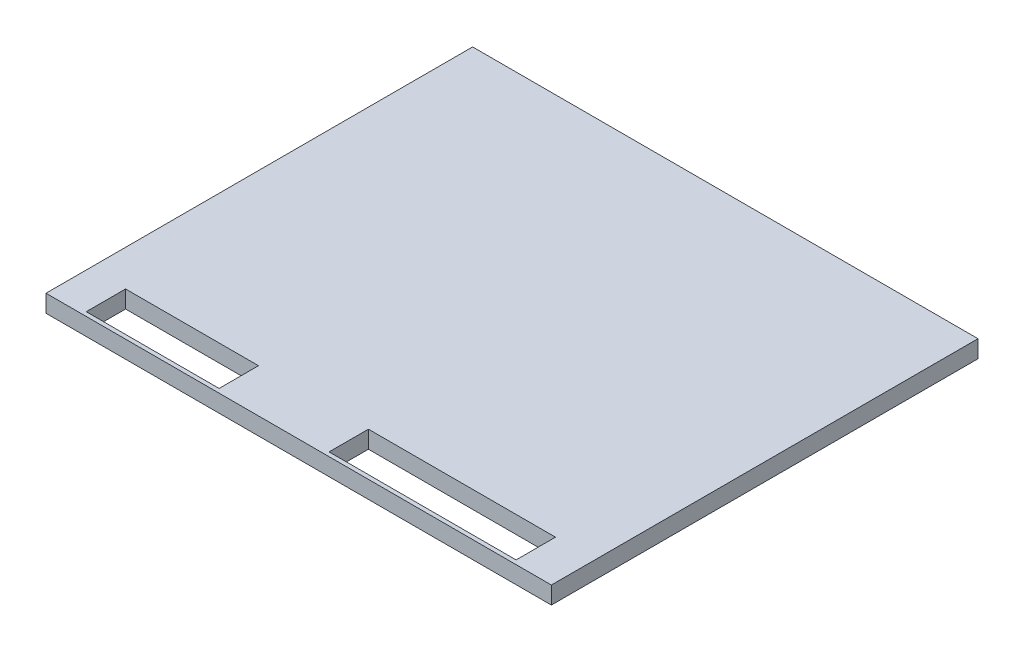
ISO-10303-21;
HEADER;
FILE_DESCRIPTION(('STEP AP214'),'2;1');
FILE_NAME('part.step','',(''),(''),'','','');
FILE_SCHEMA(('AUTOMOTIVE_DESIGN { 1 0 10303 214 1 1 1 1 }'));
ENDSEC;
DATA;
#1=APPLICATION_CONTEXT('core data for automotive mechanical design processes');
#2=APPLICATION_PROTOCOL_DEFINITION('international standard','automotive_design',2000,#1);
#3=PRODUCT_CONTEXT('',#1,'mechanical');
#4=PRODUCT('Part','Part','',(#3));
#5=PRODUCT_RELATED_PRODUCT_CATEGORY('part','',(#4));
#6=PRODUCT_DEFINITION_FORMATION('','',#4);
#7=PRODUCT_DEFINITION_CONTEXT('part definition',#1,'design');
#8=PRODUCT_DEFINITION('design','',#6,#7);
#9=PRODUCT_DEFINITION_SHAPE('','',#8);
#10=(LENGTH_UNIT() NAMED_UNIT(*) SI_UNIT(.MILLI.,.METRE.));
#11=(NAMED_UNIT(*) PLANE_ANGLE_UNIT() SI_UNIT($,.RADIAN.));
#12=(NAMED_UNIT(*) SI_UNIT($,.STERADIAN.) SOLID_ANGLE_UNIT());
#13=UNCERTAINTY_MEASURE_WITH_UNIT(LENGTH_MEASURE(1.E-05),#10,'distance_accuracy_value','');
#14=(GEOMETRIC_REPRESENTATION_CONTEXT(3) GLOBAL_UNCERTAINTY_ASSIGNED_CONTEXT((#13)) GLOBAL_UNIT_ASSIGNED_CONTEXT((#10,
#11,#12)) REPRESENTATION_CONTEXT('',''));
#15=CARTESIAN_POINT('',(0.,0.,0.));
#16=DIRECTION('',(0.,0.,1.));
#17=DIRECTION('',(1.,0.,0.));
#18=AXIS2_PLACEMENT_3D('',#15,#16,#17);
#19=CARTESIAN_POINT('',(0.,10.6,0.));
#20=DIRECTION('',(0.,1.,0.));
#21=DIRECTION('',(0.,0.,1.));
#22=AXIS2_PLACEMENT_3D('',#19,#20,#21);
#23=PLANE('',#22);
#24=DIRECTION('',(0.,0.,1.));
#25=VECTOR('',#24,1.);
#26=CARTESIAN_POINT('',(-102.555765595463,10.6,-114.215500945179));
#27=LINE('',#26,#25);
#28=CARTESIAN_POINT('',(-102.555765595463,10.6,-114.215500945179));
#29=VERTEX_POINT('',#28);
#30=CARTESIAN_POINT('',(-102.555765595463,10.6,145.784499054821));
#31=VERTEX_POINT('',#30);
#32=EDGE_CURVE('E191',#29,#31,#27,.T.);
#33=ORIENTED_EDGE('',*,*,#32,.T.);
#34=DIRECTION('',(1.,0.,0.));
#35=VECTOR('',#34,1.);
#36=CARTESIAN_POINT('',(-102.555765595463,10.6,145.784499054821));
#37=LINE('',#36,#35);
#38=CARTESIAN_POINT('',(205.444234404537,10.6,145.784499054821));
#39=VERTEX_POINT('',#38);
#40=EDGE_CURVE('E194',#31,#39,#37,.T.);
#41=ORIENTED_EDGE('',*,*,#40,.T.);
#42=DIRECTION('',(0.,0.,-1.));
#43=VECTOR('',#42,1.);
#44=CARTESIAN_POINT('',(205.444234404537,10.6,-114.215500945179));
#45=LINE('',#44,#43);
#46=CARTESIAN_POINT('',(205.444234404537,10.6,-114.215500945179));
#47=VERTEX_POINT('',#46);
#48=EDGE_CURVE('E197',#39,#47,#45,.T.);
#49=ORIENTED_EDGE('',*,*,#48,.T.);
#50=DIRECTION('',(-1.,0.,0.));
#51=VECTOR('',#50,1.);
#52=CARTESIAN_POINT('',(-102.555765595463,10.6,-114.215500945179));
#53=LINE('',#52,#51);
#54=EDGE_CURVE('E199',#47,#29,#53,.T.);
#55=ORIENTED_EDGE('',*,*,#54,.T.);
#56=EDGE_LOOP('',(#33,#41,#49,#55));
#57=FACE_BOUND('',#56,.T.);
#58=DIRECTION('',(1.,0.,0.));
#59=VECTOR('',#58,1.);
#60=CARTESIAN_POINT('',(67.4442344045369,10.6,143.284499054821));
#61=LINE('',#60,#59);
#62=CARTESIAN_POINT('',(67.4442344045369,10.6,143.284499054821));
#63=VERTEX_POINT('',#62);
#64=CARTESIAN_POINT('',(181.444234404537,10.6,143.284499054821));
#65=VERTEX_POINT('',#64);
#66=EDGE_CURVE('E162',#63,#65,#61,.T.);
#67=ORIENTED_EDGE('',*,*,#66,.F.);
#68=DIRECTION('',(0.,0.,1.));
#69=VECTOR('',#68,1.);
#70=CARTESIAN_POINT('',(67.4442344045369,10.6,119.284499054821));
#71=LINE('',#70,#69);
#72=CARTESIAN_POINT('',(67.4442344045369,10.6,119.284499054821));
#73=VERTEX_POINT('',#72);
#74=EDGE_CURVE('E160',#73,#63,#71,.T.);
#75=ORIENTED_EDGE('',*,*,#74,.F.);
#76=DIRECTION('',(-1.,0.,0.));
#77=VECTOR('',#76,1.);
#78=CARTESIAN_POINT('',(67.4442344045369,10.6,119.284499054821));
#79=LINE('',#78,#77);
#80=CARTESIAN_POINT('',(181.444234404537,10.6,119.284499054821));
#81=VERTEX_POINT('',#80);
#82=EDGE_CURVE('E168',#81,#73,#79,.T.);
#83=ORIENTED_EDGE('',*,*,#82,.F.);
#84=DIRECTION('',(0.,0.,-1.));
#85=VECTOR('',#84,1.);
#86=CARTESIAN_POINT('',(181.444234404537,10.6,119.284499054821));
#87=LINE('',#86,#85);
#88=EDGE_CURVE('E165',#65,#81,#87,.T.);
#89=ORIENTED_EDGE('',*,*,#88,.F.);
#90=EDGE_LOOP('',(#67,#75,#83,#89));
#91=FACE_BOUND('',#90,.T.);
#92=DIRECTION('',(1.,0.,0.));
#93=VECTOR('',#92,1.);
#94=CARTESIAN_POINT('',(-80.5557655954632,10.6,143.284499054821));
#95=LINE('',#94,#93);
#96=CARTESIAN_POINT('',(-80.5557655954632,10.6,143.284499054821));
#97=VERTEX_POINT('',#96);
#98=CARTESIAN_POINT('',(0.444234404536864,10.6,143.284499054821));
#99=VERTEX_POINT('',#98);
#100=EDGE_CURVE('E132',#97,#99,#95,.T.);
#101=ORIENTED_EDGE('',*,*,#100,.F.);
#102=DIRECTION('',(0.,0.,1.));
#103=VECTOR('',#102,1.);
#104=CARTESIAN_POINT('',(-80.5557655954632,10.6,119.284499054821));
#105=LINE('',#104,#103);
#106=CARTESIAN_POINT('',(-80.5557655954632,10.6,119.284499054821));
#107=VERTEX_POINT('',#106);
#108=EDGE_CURVE('E124',#107,#97,#105,.T.);
#109=ORIENTED_EDGE('',*,*,#108,.F.);
#110=DIRECTION('',(-1.,0.,0.));
#111=VECTOR('',#110,1.);
#112=CARTESIAN_POINT('',(-80.5557655954632,10.6,119.284499054821));
#113=LINE('',#112,#111);
#114=CARTESIAN_POINT('',(0.444234404536864,10.6,119.284499054821));
#115=VERTEX_POINT('',#114);
#116=EDGE_CURVE('E146',#115,#107,#113,.T.);
#117=ORIENTED_EDGE('',*,*,#116,.F.);
#118=DIRECTION('',(0.,0.,-1.));
#119=VECTOR('',#118,1.);
#120=CARTESIAN_POINT('',(0.444234404536864,10.6,119.284499054821));
#121=LINE('',#120,#119);
#122=EDGE_CURVE('E144',#99,#115,#121,.T.);
#123=ORIENTED_EDGE('',*,*,#122,.F.);
#124=EDGE_LOOP('',(#101,#109,#117,#123));
#125=FACE_BOUND('',#124,.T.);
#126=ADVANCED_FACE('F35',(#57,#91,#125),#23,.T.);
#127=CARTESIAN_POINT('',(0.,0.,0.));
#128=DIRECTION('',(0.,1.,0.));
#129=DIRECTION('',(0.,0.,1.));
#130=AXIS2_PLACEMENT_3D('',#127,#128,#129);
#131=PLANE('',#130);
#132=DIRECTION('',(0.,0.,1.));
#133=VECTOR('',#132,1.);
#134=CARTESIAN_POINT('',(67.4442344045369,0.,119.284499054821));
#135=LINE('',#134,#133);
#136=CARTESIAN_POINT('',(67.4442344045369,0.,119.284499054821));
#137=VERTEX_POINT('',#136);
#138=CARTESIAN_POINT('',(67.4442344045369,0.,143.284499054821));
#139=VERTEX_POINT('',#138);
#140=EDGE_CURVE('E140',#137,#139,#135,.T.);
#141=ORIENTED_EDGE('',*,*,#140,.T.);
#142=DIRECTION('',(1.,0.,0.));
#143=VECTOR('',#142,1.);
#144=CARTESIAN_POINT('',(67.4442344045369,0.,143.284499054821));
#145=LINE('',#144,#143);
#146=CARTESIAN_POINT('',(181.444234404537,0.,143.284499054821));
#147=VERTEX_POINT('',#146);
#148=EDGE_CURVE('E173',#139,#147,#145,.T.);
#149=ORIENTED_EDGE('',*,*,#148,.T.);
#150=DIRECTION('',(0.,0.,-1.));
#151=VECTOR('',#150,1.);
#152=CARTESIAN_POINT('',(181.444234404537,0.,119.284499054821));
#153=LINE('',#152,#151);
#154=CARTESIAN_POINT('',(181.444234404537,0.,119.284499054821));
#155=VERTEX_POINT('',#154);
#156=EDGE_CURVE('E176',#147,#155,#153,.T.);
#157=ORIENTED_EDGE('',*,*,#156,.T.);
#158=DIRECTION('',(-1.,0.,0.));
#159=VECTOR('',#158,1.);
#160=CARTESIAN_POINT('',(67.4442344045369,0.,119.284499054821));
#161=LINE('',#160,#159);
#162=EDGE_CURVE('E163',#155,#137,#161,.T.);
#163=ORIENTED_EDGE('',*,*,#162,.T.);
#164=EDGE_LOOP('',(#141,#149,#157,#163));
#165=FACE_BOUND('',#164,.T.);
#166=DIRECTION('',(0.,0.,1.));
#167=VECTOR('',#166,1.);
#168=CARTESIAN_POINT('',(-102.555765595463,0.,-114.215500945179));
#169=LINE('',#168,#167);
#170=CARTESIAN_POINT('',(-102.555765595463,0.,-114.215500945179));
#171=VERTEX_POINT('',#170);
#172=CARTESIAN_POINT('',(-102.555765595463,0.,145.784499054821));
#173=VERTEX_POINT('',#172);
#174=EDGE_CURVE('E190',#171,#173,#169,.T.);
#175=ORIENTED_EDGE('',*,*,#174,.F.);
#176=DIRECTION('',(-1.,0.,0.));
#177=VECTOR('',#176,1.);
#178=CARTESIAN_POINT('',(-102.555765595463,0.,-114.215500945179));
#179=LINE('',#178,#177);
#180=CARTESIAN_POINT('',(205.444234404537,0.,-114.215500945179));
#181=VERTEX_POINT('',#180);
#182=EDGE_CURVE('E195',#181,#171,#179,.T.);
#183=ORIENTED_EDGE('',*,*,#182,.F.);
#184=DIRECTION('',(0.,0.,-1.));
#185=VECTOR('',#184,1.);
#186=CARTESIAN_POINT('',(205.444234404537,0.,-114.215500945179));
#187=LINE('',#186,#185);
#188=CARTESIAN_POINT('',(205.444234404537,0.,145.784499054821));
#189=VERTEX_POINT('',#188);
#190=EDGE_CURVE('E206',#189,#181,#187,.T.);
#191=ORIENTED_EDGE('',*,*,#190,.F.);
#192=DIRECTION('',(1.,0.,0.));
#193=VECTOR('',#192,1.);
#194=CARTESIAN_POINT('',(-102.555765595463,0.,145.784499054821));
#195=LINE('',#194,#193);
#196=EDGE_CURVE('E204',#173,#189,#195,.T.);
#197=ORIENTED_EDGE('',*,*,#196,.F.);
#198=EDGE_LOOP('',(#175,#183,#191,#197));
#199=FACE_BOUND('',#198,.T.);
#200=DIRECTION('',(0.,0.,1.));
#201=VECTOR('',#200,1.);
#202=CARTESIAN_POINT('',(-80.5557655954632,0.,119.284499054821));
#203=LINE('',#202,#201);
#204=CARTESIAN_POINT('',(-80.5557655954632,0.,119.284499054821));
#205=VERTEX_POINT('',#204);
#206=CARTESIAN_POINT('',(-80.5557655954632,0.,143.284499054821));
#207=VERTEX_POINT('',#206);
#208=EDGE_CURVE('E58',#205,#207,#203,.T.);
#209=ORIENTED_EDGE('',*,*,#208,.T.);
#210=DIRECTION('',(1.,0.,0.));
#211=VECTOR('',#210,1.);
#212=CARTESIAN_POINT('',(-80.5557655954632,0.,143.284499054821));
#213=LINE('',#212,#211);
#214=CARTESIAN_POINT('',(0.444234404536864,0.,143.284499054821));
#215=VERTEX_POINT('',#214);
#216=EDGE_CURVE('E139',#207,#215,#213,.T.);
#217=ORIENTED_EDGE('',*,*,#216,.T.);
#218=DIRECTION('',(0.,0.,-1.));
#219=VECTOR('',#218,1.);
#220=CARTESIAN_POINT('',(0.444234404536864,0.,119.284499054821));
#221=LINE('',#220,#219);
#222=CARTESIAN_POINT('',(0.444234404536864,0.,119.284499054821));
#223=VERTEX_POINT('',#222);
#224=EDGE_CURVE('E152',#215,#223,#221,.T.);
#225=ORIENTED_EDGE('',*,*,#224,.T.);
#226=DIRECTION('',(-1.,0.,0.));
#227=VECTOR('',#226,1.);
#228=CARTESIAN_POINT('',(-80.5557655954632,0.,119.284499054821));
#229=LINE('',#228,#227);
#230=EDGE_CURVE('E133',#223,#205,#229,.T.);
#231=ORIENTED_EDGE('',*,*,#230,.T.);
#232=EDGE_LOOP('',(#209,#217,#225,#231));
#233=FACE_BOUND('',#232,.T.);
#234=ADVANCED_FACE('F224',(#165,#199,#233),#131,.F.);
#235=CARTESIAN_POINT('',(-102.555765595463,10.6,-114.215500945179));
#236=DIRECTION('',(1.,0.,0.));
#237=DIRECTION('',(0.,0.,-1.));
#238=AXIS2_PLACEMENT_3D('',#235,#236,#237);
#239=PLANE('',#238);
#240=ORIENTED_EDGE('',*,*,#174,.T.);
#241=DIRECTION('',(0.,-1.,0.));
#242=VECTOR('',#241,1.);
#243=CARTESIAN_POINT('',(-102.555765595463,10.6,145.784499054821));
#244=LINE('',#243,#242);
#245=EDGE_CURVE('E11',#31,#173,#244,.T.);
#246=ORIENTED_EDGE('',*,*,#245,.F.);
#247=ORIENTED_EDGE('',*,*,#32,.F.);
#248=DIRECTION('',(0.,-1.,0.));
#249=VECTOR('',#248,1.);
#250=CARTESIAN_POINT('',(-102.555765595463,10.6,-114.215500945179));
#251=LINE('',#250,#249);
#252=EDGE_CURVE('E201',#29,#171,#251,.T.);
#253=ORIENTED_EDGE('',*,*,#252,.T.);
#254=EDGE_LOOP('',(#240,#246,#247,#253));
#255=FACE_BOUND('',#254,.T.);
#256=ADVANCED_FACE('F37',(#255),#239,.F.);
#257=CARTESIAN_POINT('',(-102.555765595463,10.6,145.784499054821));
#258=DIRECTION('',(0.,0.,-1.));
#259=DIRECTION('',(-1.,0.,0.));
#260=AXIS2_PLACEMENT_3D('',#257,#258,#259);
#261=PLANE('',#260);
#262=ORIENTED_EDGE('',*,*,#196,.T.);
#263=DIRECTION('',(0.,-1.,0.));
#264=VECTOR('',#263,1.);
#265=CARTESIAN_POINT('',(205.444234404537,10.6,145.784499054821));
#266=LINE('',#265,#264);
#267=EDGE_CURVE('E43',#39,#189,#266,.T.);
#268=ORIENTED_EDGE('',*,*,#267,.F.);
#269=ORIENTED_EDGE('',*,*,#40,.F.);
#270=ORIENTED_EDGE('',*,*,#245,.T.);
#271=EDGE_LOOP('',(#262,#268,#269,#270));
#272=FACE_BOUND('',#271,.T.);
#273=ADVANCED_FACE('F235',(#272),#261,.F.);
#274=CARTESIAN_POINT('',(205.444234404537,10.6,-114.215500945179));
#275=DIRECTION('',(-1.,0.,0.));
#276=DIRECTION('',(0.,0.,1.));
#277=AXIS2_PLACEMENT_3D('',#274,#275,#276);
#278=PLANE('',#277);
#279=ORIENTED_EDGE('',*,*,#190,.T.);
#280=DIRECTION('',(0.,-1.,0.));
#281=VECTOR('',#280,1.);
#282=CARTESIAN_POINT('',(205.444234404537,10.6,-114.215500945179));
#283=LINE('',#282,#281);
#284=EDGE_CURVE('E211',#47,#181,#283,.T.);
#285=ORIENTED_EDGE('',*,*,#284,.F.);
#286=ORIENTED_EDGE('',*,*,#48,.F.);
#287=ORIENTED_EDGE('',*,*,#267,.T.);
#288=EDGE_LOOP('',(#279,#285,#286,#287));
#289=FACE_BOUND('',#288,.T.);
#290=ADVANCED_FACE('F218',(#289),#278,.F.);
#291=CARTESIAN_POINT('',(-102.555765595463,10.6,-114.215500945179));
#292=DIRECTION('',(0.,0.,1.));
#293=DIRECTION('',(1.,0.,0.));
#294=AXIS2_PLACEMENT_3D('',#291,#292,#293);
#295=PLANE('',#294);
#296=ORIENTED_EDGE('',*,*,#182,.T.);
#297=ORIENTED_EDGE('',*,*,#252,.F.);
#298=ORIENTED_EDGE('',*,*,#54,.F.);
#299=ORIENTED_EDGE('',*,*,#284,.T.);
#300=EDGE_LOOP('',(#296,#297,#298,#299));
#301=FACE_BOUND('',#300,.T.);
#302=ADVANCED_FACE('F228',(#301),#295,.F.);
#303=CARTESIAN_POINT('',(67.4442344045369,10.6,119.284499054821));
#304=DIRECTION('',(1.,0.,0.));
#305=DIRECTION('',(0.,0.,-1.));
#306=AXIS2_PLACEMENT_3D('',#303,#304,#305);
#307=PLANE('',#306);
#308=ORIENTED_EDGE('',*,*,#140,.F.);
#309=DIRECTION('',(0.,-1.,0.));
#310=VECTOR('',#309,1.);
#311=CARTESIAN_POINT('',(67.4442344045369,10.6,119.284499054821));
#312=LINE('',#311,#310);
#313=EDGE_CURVE('E170',#73,#137,#312,.T.);
#314=ORIENTED_EDGE('',*,*,#313,.F.);
#315=ORIENTED_EDGE('',*,*,#74,.T.);
#316=DIRECTION('',(0.,-1.,0.));
#317=VECTOR('',#316,1.);
#318=CARTESIAN_POINT('',(67.4442344045369,10.6,143.284499054821));
#319=LINE('',#318,#317);
#320=EDGE_CURVE('E187',#63,#139,#319,.T.);
#321=ORIENTED_EDGE('',*,*,#320,.T.);
#322=EDGE_LOOP('',(#308,#314,#315,#321));
#323=FACE_BOUND('',#322,.T.);
#324=ADVANCED_FACE('F250',(#323),#307,.T.);
#325=CARTESIAN_POINT('',(67.4442344045369,10.6,143.284499054821));
#326=DIRECTION('',(0.,0.,-1.));
#327=DIRECTION('',(-1.,0.,0.));
#328=AXIS2_PLACEMENT_3D('',#325,#326,#327);
#329=PLANE('',#328);
#330=ORIENTED_EDGE('',*,*,#148,.F.);
#331=ORIENTED_EDGE('',*,*,#320,.F.);
#332=ORIENTED_EDGE('',*,*,#66,.T.);
#333=DIRECTION('',(0.,-1.,0.));
#334=VECTOR('',#333,1.);
#335=CARTESIAN_POINT('',(181.444234404537,10.6,143.284499054821));
#336=LINE('',#335,#334);
#337=EDGE_CURVE('E185',#65,#147,#336,.T.);
#338=ORIENTED_EDGE('',*,*,#337,.T.);
#339=EDGE_LOOP('',(#330,#331,#332,#338));
#340=FACE_BOUND('',#339,.T.);
#341=ADVANCED_FACE('F257',(#340),#329,.T.);
#342=CARTESIAN_POINT('',(181.444234404537,10.6,119.284499054821));
#343=DIRECTION('',(-1.,0.,0.));
#344=DIRECTION('',(0.,0.,1.));
#345=AXIS2_PLACEMENT_3D('',#342,#343,#344);
#346=PLANE('',#345);
#347=ORIENTED_EDGE('',*,*,#156,.F.);
#348=ORIENTED_EDGE('',*,*,#337,.F.);
#349=ORIENTED_EDGE('',*,*,#88,.T.);
#350=DIRECTION('',(0.,-1.,0.));
#351=VECTOR('',#350,1.);
#352=CARTESIAN_POINT('',(181.444234404537,10.6,119.284499054821));
#353=LINE('',#352,#351);
#354=EDGE_CURVE('E183',#81,#155,#353,.T.);
#355=ORIENTED_EDGE('',*,*,#354,.T.);
#356=EDGE_LOOP('',(#347,#348,#349,#355));
#357=FACE_BOUND('',#356,.T.);
#358=ADVANCED_FACE('F262',(#357),#346,.T.);
#359=CARTESIAN_POINT('',(67.4442344045369,10.6,119.284499054821));
#360=DIRECTION('',(0.,0.,1.));
#361=DIRECTION('',(1.,0.,0.));
#362=AXIS2_PLACEMENT_3D('',#359,#360,#361);
#363=PLANE('',#362);
#364=ORIENTED_EDGE('',*,*,#162,.F.);
#365=ORIENTED_EDGE('',*,*,#354,.F.);
#366=ORIENTED_EDGE('',*,*,#82,.T.);
#367=ORIENTED_EDGE('',*,*,#313,.T.);
#368=EDGE_LOOP('',(#364,#365,#366,#367));
#369=FACE_BOUND('',#368,.T.);
#370=ADVANCED_FACE('F269',(#369),#363,.T.);
#371=CARTESIAN_POINT('',(-80.5557655954632,10.6,119.284499054821));
#372=DIRECTION('',(1.,0.,0.));
#373=DIRECTION('',(0.,0.,-1.));
#374=AXIS2_PLACEMENT_3D('',#371,#372,#373);
#375=PLANE('',#374);
#376=ORIENTED_EDGE('',*,*,#208,.F.);
#377=DIRECTION('',(0.,-1.,0.));
#378=VECTOR('',#377,1.);
#379=CARTESIAN_POINT('',(-80.5557655954632,10.6,119.284499054821));
#380=LINE('',#379,#378);
#381=EDGE_CURVE('E128',#107,#205,#380,.T.);
#382=ORIENTED_EDGE('',*,*,#381,.F.);
#383=ORIENTED_EDGE('',*,*,#108,.T.);
#384=DIRECTION('',(0.,-1.,0.));
#385=VECTOR('',#384,1.);
#386=CARTESIAN_POINT('',(-80.5557655954632,10.6,143.284499054821));
#387=LINE('',#386,#385);
#388=EDGE_CURVE('E127',#97,#207,#387,.T.);
#389=ORIENTED_EDGE('',*,*,#388,.T.);
#390=EDGE_LOOP('',(#376,#382,#383,#389));
#391=FACE_BOUND('',#390,.T.);
#392=ADVANCED_FACE('F126',(#391),#375,.T.);
#393=CARTESIAN_POINT('',(-80.5557655954632,10.6,143.284499054821));
#394=DIRECTION('',(0.,0.,-1.));
#395=DIRECTION('',(-1.,0.,0.));
#396=AXIS2_PLACEMENT_3D('',#393,#394,#395);
#397=PLANE('',#396);
#398=ORIENTED_EDGE('',*,*,#216,.F.);
#399=ORIENTED_EDGE('',*,*,#388,.F.);
#400=ORIENTED_EDGE('',*,*,#100,.T.);
#401=DIRECTION('',(0.,-1.,0.));
#402=VECTOR('',#401,1.);
#403=CARTESIAN_POINT('',(0.444234404536864,10.6,143.284499054821));
#404=LINE('',#403,#402);
#405=EDGE_CURVE('E141',#99,#215,#404,.T.);
#406=ORIENTED_EDGE('',*,*,#405,.T.);
#407=EDGE_LOOP('',(#398,#399,#400,#406));
#408=FACE_BOUND('',#407,.T.);
#409=ADVANCED_FACE('F136',(#408),#397,.T.);
#410=CARTESIAN_POINT('',(0.444234404536864,10.6,119.284499054821));
#411=DIRECTION('',(-1.,0.,0.));
#412=DIRECTION('',(0.,0.,1.));
#413=AXIS2_PLACEMENT_3D('',#410,#411,#412);
#414=PLANE('',#413);
#415=ORIENTED_EDGE('',*,*,#224,.F.);
#416=ORIENTED_EDGE('',*,*,#405,.F.);
#417=ORIENTED_EDGE('',*,*,#122,.T.);
#418=DIRECTION('',(0.,-1.,0.));
#419=VECTOR('',#418,1.);
#420=CARTESIAN_POINT('',(0.444234404536864,10.6,119.284499054821));
#421=LINE('',#420,#419);
#422=EDGE_CURVE('E50',#115,#223,#421,.T.);
#423=ORIENTED_EDGE('',*,*,#422,.T.);
#424=EDGE_LOOP('',(#415,#416,#417,#423));
#425=FACE_BOUND('',#424,.T.);
#426=ADVANCED_FACE('F287',(#425),#414,.T.);
#427=CARTESIAN_POINT('',(-80.5557655954632,10.6,119.284499054821));
#428=DIRECTION('',(0.,0.,1.));
#429=DIRECTION('',(1.,0.,0.));
#430=AXIS2_PLACEMENT_3D('',#427,#428,#429);
#431=PLANE('',#430);
#432=ORIENTED_EDGE('',*,*,#230,.F.);
#433=ORIENTED_EDGE('',*,*,#422,.F.);
#434=ORIENTED_EDGE('',*,*,#116,.T.);
#435=ORIENTED_EDGE('',*,*,#381,.T.);
#436=EDGE_LOOP('',(#432,#433,#434,#435));
#437=FACE_BOUND('',#436,.T.);
#438=ADVANCED_FACE('F290',(#437),#431,.T.);
#439=CLOSED_SHELL('',(#126,#234,#256,#273,#290,#302,#324,#341,#358,#370,#392,#409,#426,#438));
#440=MANIFOLD_SOLID_BREP('B2',#439);
#441=ADVANCED_BREP_SHAPE_REPRESENTATION('',(#18,#440),#14);
#442=SHAPE_DEFINITION_REPRESENTATION(#9,#441);
ENDSEC;
END-ISO-10303-21;
